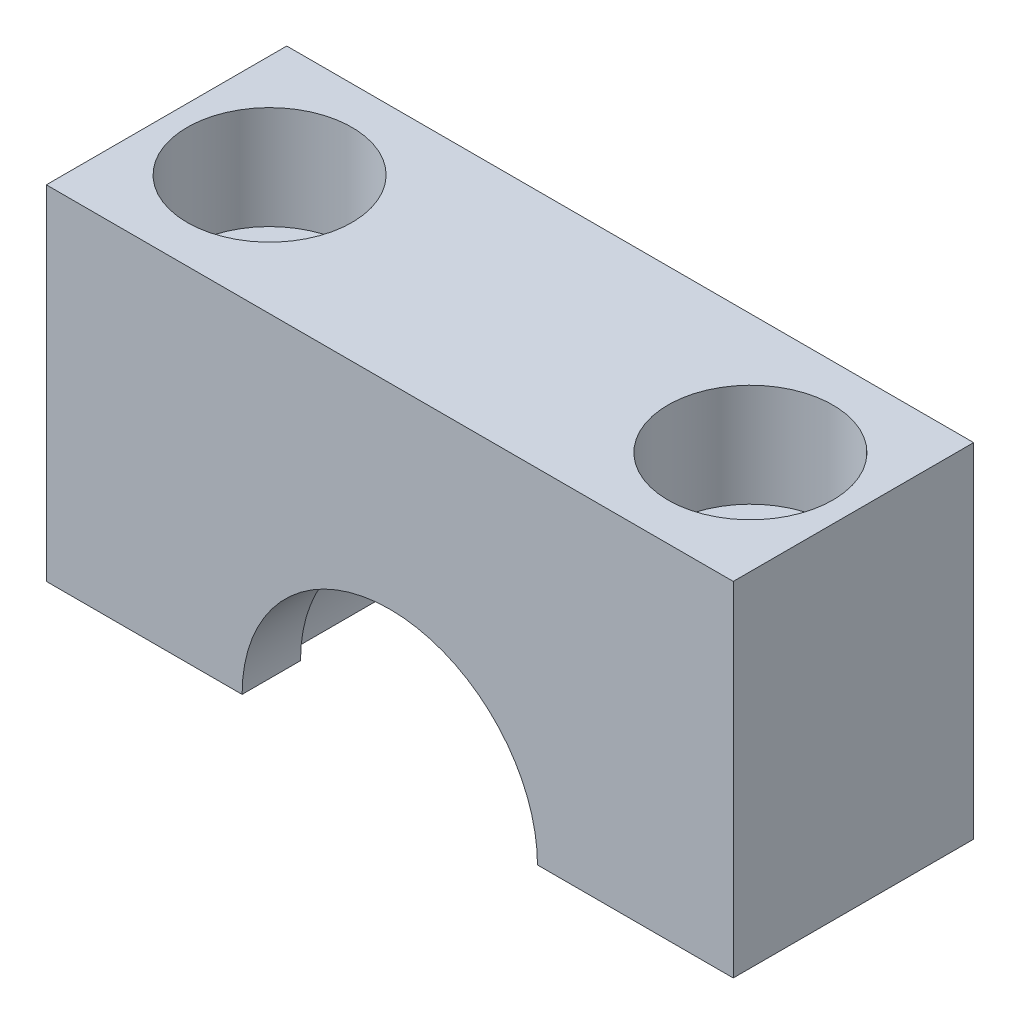
ISO-10303-21;
HEADER;
FILE_DESCRIPTION(('STEP AP214'),'2;1');
FILE_NAME('part.step','',(''),(''),'','','');
FILE_SCHEMA(('AUTOMOTIVE_DESIGN { 1 0 10303 214 1 1 1 1 }'));
ENDSEC;
DATA;
#1=APPLICATION_CONTEXT('core data for automotive mechanical design processes');
#2=APPLICATION_PROTOCOL_DEFINITION('international standard','automotive_design',2000,#1);
#3=PRODUCT_CONTEXT('',#1,'mechanical');
#4=PRODUCT('Part','Part','',(#3));
#5=PRODUCT_RELATED_PRODUCT_CATEGORY('part','',(#4));
#6=PRODUCT_DEFINITION_FORMATION('','',#4);
#7=PRODUCT_DEFINITION_CONTEXT('part definition',#1,'design');
#8=PRODUCT_DEFINITION('design','',#6,#7);
#9=PRODUCT_DEFINITION_SHAPE('','',#8);
#10=(LENGTH_UNIT() NAMED_UNIT(*) SI_UNIT(.MILLI.,.METRE.));
#11=(NAMED_UNIT(*) PLANE_ANGLE_UNIT() SI_UNIT($,.RADIAN.));
#12=(NAMED_UNIT(*) SI_UNIT($,.STERADIAN.) SOLID_ANGLE_UNIT());
#13=UNCERTAINTY_MEASURE_WITH_UNIT(LENGTH_MEASURE(1.E-05),#10,'distance_accuracy_value','');
#14=(GEOMETRIC_REPRESENTATION_CONTEXT(3) GLOBAL_UNCERTAINTY_ASSIGNED_CONTEXT((#13)) GLOBAL_UNIT_ASSIGNED_CONTEXT((#10,
#11,#12)) REPRESENTATION_CONTEXT('',''));
#15=CARTESIAN_POINT('',(0.,0.,0.));
#16=DIRECTION('',(0.,0.,1.));
#17=DIRECTION('',(1.,0.,0.));
#18=AXIS2_PLACEMENT_3D('',#15,#16,#17);
#19=CARTESIAN_POINT('',(-50.,-25.,17.5));
#20=DIRECTION('',(0.,1.,0.));
#21=DIRECTION('',(0.,0.,1.));
#22=AXIS2_PLACEMENT_3D('',#19,#20,#21);
#23=PLANE('',#22);
#24=CARTESIAN_POINT('',(-35.,-25.,0.));
#25=DIRECTION('',(0.,1.,0.));
#26=DIRECTION('',(0.,0.,1.));
#27=AXIS2_PLACEMENT_3D('',#24,#25,#26);
#28=CIRCLE('',#27,7.5);
#29=CARTESIAN_POINT('',(-35.,-25.,7.5));
#30=VERTEX_POINT('',#29);
#31=EDGE_CURVE('E140',#30,#30,#28,.T.);
#32=ORIENTED_EDGE('',*,*,#31,.T.);
#33=EDGE_LOOP('',(#32));
#34=FACE_BOUND('',#33,.T.);
#35=DIRECTION('',(1.,0.,0.));
#36=VECTOR('',#35,1.);
#37=CARTESIAN_POINT('',(-50.,-25.,-9.));
#38=LINE('',#37,#36);
#39=CARTESIAN_POINT('',(-23.5,-25.,-8.99999999999999));
#40=VERTEX_POINT('',#39);
#41=CARTESIAN_POINT('',(-21.5,-25.,-8.99999999999999));
#42=VERTEX_POINT('',#41);
#43=EDGE_CURVE('E200',#40,#42,#38,.T.);
#44=ORIENTED_EDGE('',*,*,#43,.F.);
#45=DIRECTION('',(0.,0.,1.));
#46=VECTOR('',#45,1.);
#47=CARTESIAN_POINT('',(-23.5,-25.,-8.99999999999999));
#48=LINE('',#47,#46);
#49=CARTESIAN_POINT('',(-23.5,-25.,9.));
#50=VERTEX_POINT('',#49);
#51=EDGE_CURVE('E188',#40,#50,#48,.T.);
#52=ORIENTED_EDGE('',*,*,#51,.T.);
#53=DIRECTION('',(1.,0.,0.));
#54=VECTOR('',#53,1.);
#55=CARTESIAN_POINT('',(-50.,-25.,9.00000000000001));
#56=LINE('',#55,#54);
#57=CARTESIAN_POINT('',(-21.5,-25.,9.));
#58=VERTEX_POINT('',#57);
#59=EDGE_CURVE('E122',#50,#58,#56,.T.);
#60=ORIENTED_EDGE('',*,*,#59,.T.);
#61=DIRECTION('',(0.,0.,-1.));
#62=VECTOR('',#61,1.);
#63=CARTESIAN_POINT('',(-21.5,-25.,17.5));
#64=LINE('',#63,#62);
#65=CARTESIAN_POINT('',(-21.5,-25.,17.5));
#66=VERTEX_POINT('',#65);
#67=EDGE_CURVE('E118',#66,#58,#64,.T.);
#68=ORIENTED_EDGE('',*,*,#67,.F.);
#69=DIRECTION('',(1.,0.,0.));
#70=VECTOR('',#69,1.);
#71=CARTESIAN_POINT('',(-50.,-25.,17.5));
#72=LINE('',#71,#70);
#73=CARTESIAN_POINT('',(-50.,-25.,17.5));
#74=VERTEX_POINT('',#73);
#75=EDGE_CURVE('E104',#74,#66,#72,.T.);
#76=ORIENTED_EDGE('',*,*,#75,.F.);
#77=DIRECTION('',(0.,0.,-1.));
#78=VECTOR('',#77,1.);
#79=CARTESIAN_POINT('',(-50.,-25.,17.5));
#80=LINE('',#79,#78);
#81=CARTESIAN_POINT('',(-50.,-25.,-17.5));
#82=VERTEX_POINT('',#81);
#83=EDGE_CURVE('E125',#74,#82,#80,.T.);
#84=ORIENTED_EDGE('',*,*,#83,.T.);
#85=DIRECTION('',(1.,0.,0.));
#86=VECTOR('',#85,1.);
#87=CARTESIAN_POINT('',(-50.,-25.,-17.5));
#88=LINE('',#87,#86);
#89=CARTESIAN_POINT('',(-21.5,-25.,-17.5));
#90=VERTEX_POINT('',#89);
#91=EDGE_CURVE('E144',#82,#90,#88,.T.);
#92=ORIENTED_EDGE('',*,*,#91,.T.);
#93=EDGE_CURVE('E126',#42,#90,#64,.T.);
#94=ORIENTED_EDGE('',*,*,#93,.F.);
#95=EDGE_LOOP('',(#44,#52,#60,#68,#76,#84,#92,#94));
#96=FACE_BOUND('',#95,.T.);
#97=ADVANCED_FACE('F36',(#34,#96),#23,.F.);
#98=CARTESIAN_POINT('',(0.,-25.,17.5));
#99=DIRECTION('',(0.,0.,-1.));
#100=DIRECTION('',(-1.,0.,0.));
#101=AXIS2_PLACEMENT_3D('',#98,#99,#100);
#102=CYLINDRICAL_SURFACE('',#101,21.5);
#103=CARTESIAN_POINT('',(0.,-25.,-9.));
#104=DIRECTION('',(0.,0.,1.));
#105=DIRECTION('',(1.,0.,0.));
#106=AXIS2_PLACEMENT_3D('',#103,#104,#105);
#107=CIRCLE('',#106,21.5);
#108=CARTESIAN_POINT('',(21.5,-25.,-9.));
#109=VERTEX_POINT('',#108);
#110=EDGE_CURVE('E197',#42,#109,#107,.F.);
#111=ORIENTED_EDGE('',*,*,#110,.F.);
#112=ORIENTED_EDGE('',*,*,#93,.T.);
#113=CARTESIAN_POINT('',(0.,-25.,-17.5));
#114=DIRECTION('',(0.,0.,-1.));
#115=DIRECTION('',(1.,0.,0.));
#116=AXIS2_PLACEMENT_3D('',#113,#114,#115);
#117=CIRCLE('',#116,21.5);
#118=CARTESIAN_POINT('',(21.5,-25.,-17.5));
#119=VERTEX_POINT('',#118);
#120=EDGE_CURVE('E147',#90,#119,#117,.T.);
#121=ORIENTED_EDGE('',*,*,#120,.T.);
#122=DIRECTION('',(0.,0.,-1.));
#123=VECTOR('',#122,1.);
#124=CARTESIAN_POINT('',(21.5,-25.,17.5));
#125=LINE('',#124,#123);
#126=EDGE_CURVE('E153',#109,#119,#125,.T.);
#127=ORIENTED_EDGE('',*,*,#126,.F.);
#128=EDGE_LOOP('',(#111,#112,#121,#127));
#129=FACE_BOUND('',#128,.T.);
#130=ADVANCED_FACE('F231',(#129),#102,.F.);
#131=CARTESIAN_POINT('',(21.5,-25.,17.5));
#132=DIRECTION('',(0.,1.,0.));
#133=DIRECTION('',(0.,0.,1.));
#134=AXIS2_PLACEMENT_3D('',#131,#132,#133);
#135=PLANE('',#134);
#136=CARTESIAN_POINT('',(34.9999999999999,-25.,0.));
#137=DIRECTION('',(0.,1.,0.));
#138=DIRECTION('',(0.,0.,1.));
#139=AXIS2_PLACEMENT_3D('',#136,#137,#138);
#140=CIRCLE('',#139,7.49999999999999);
#141=CARTESIAN_POINT('',(34.9999999999999,-25.,7.49999999999999));
#142=VERTEX_POINT('',#141);
#143=EDGE_CURVE('E165',#142,#142,#140,.T.);
#144=ORIENTED_EDGE('',*,*,#143,.T.);
#145=EDGE_LOOP('',(#144));
#146=FACE_BOUND('',#145,.T.);
#147=DIRECTION('',(1.,0.,0.));
#148=VECTOR('',#147,1.);
#149=CARTESIAN_POINT('',(21.5,-25.,-9.));
#150=LINE('',#149,#148);
#151=CARTESIAN_POINT('',(23.5,-25.,-9.));
#152=VERTEX_POINT('',#151);
#153=EDGE_CURVE('E11',#109,#152,#150,.T.);
#154=ORIENTED_EDGE('',*,*,#153,.F.);
#155=ORIENTED_EDGE('',*,*,#126,.T.);
#156=DIRECTION('',(1.,0.,0.));
#157=VECTOR('',#156,1.);
#158=CARTESIAN_POINT('',(21.5,-25.,-17.5));
#159=LINE('',#158,#157);
#160=CARTESIAN_POINT('',(50.,-25.,-17.5));
#161=VERTEX_POINT('',#160);
#162=EDGE_CURVE('E86',#119,#161,#159,.T.);
#163=ORIENTED_EDGE('',*,*,#162,.T.);
#164=DIRECTION('',(0.,0.,-1.));
#165=VECTOR('',#164,1.);
#166=CARTESIAN_POINT('',(50.,-25.,17.5));
#167=LINE('',#166,#165);
#168=CARTESIAN_POINT('',(50.,-25.,17.5));
#169=VERTEX_POINT('',#168);
#170=EDGE_CURVE('E132',#169,#161,#167,.T.);
#171=ORIENTED_EDGE('',*,*,#170,.F.);
#172=DIRECTION('',(1.,0.,0.));
#173=VECTOR('',#172,1.);
#174=CARTESIAN_POINT('',(21.5,-25.,17.5));
#175=LINE('',#174,#173);
#176=CARTESIAN_POINT('',(21.5,-25.,17.5));
#177=VERTEX_POINT('',#176);
#178=EDGE_CURVE('E60',#177,#169,#175,.T.);
#179=ORIENTED_EDGE('',*,*,#178,.F.);
#180=CARTESIAN_POINT('',(21.5,-25.,9.));
#181=VERTEX_POINT('',#180);
#182=EDGE_CURVE('E130',#177,#181,#125,.T.);
#183=ORIENTED_EDGE('',*,*,#182,.T.);
#184=DIRECTION('',(1.,0.,0.));
#185=VECTOR('',#184,1.);
#186=CARTESIAN_POINT('',(21.5,-25.,9.));
#187=LINE('',#186,#185);
#188=CARTESIAN_POINT('',(23.5,-25.,9.));
#189=VERTEX_POINT('',#188);
#190=EDGE_CURVE('E161',#181,#189,#187,.T.);
#191=ORIENTED_EDGE('',*,*,#190,.T.);
#192=DIRECTION('',(0.,0.,1.));
#193=VECTOR('',#192,1.);
#194=CARTESIAN_POINT('',(23.5,-25.,-9.));
#195=LINE('',#194,#193);
#196=EDGE_CURVE('E44',#189,#152,#195,.F.);
#197=ORIENTED_EDGE('',*,*,#196,.T.);
#198=EDGE_LOOP('',(#154,#155,#163,#171,#179,#183,#191,#197));
#199=FACE_BOUND('',#198,.T.);
#200=ADVANCED_FACE('F176',(#146,#199),#135,.F.);
#201=CARTESIAN_POINT('',(34.9999999999999,-25.,0.));
#202=DIRECTION('',(0.,1.,0.));
#203=DIRECTION('',(0.,0.,1.));
#204=AXIS2_PLACEMENT_3D('',#201,#202,#203);
#205=CYLINDRICAL_SURFACE('',#204,7.49999999999999);
#206=ORIENTED_EDGE('',*,*,#143,.F.);
#207=EDGE_LOOP('',(#206));
#208=FACE_BOUND('',#207,.T.);
#209=CARTESIAN_POINT('',(34.9999999999999,10.,0.));
#210=DIRECTION('',(0.,1.,0.));
#211=DIRECTION('',(0.,0.,1.));
#212=AXIS2_PLACEMENT_3D('',#209,#210,#211);
#213=CIRCLE('',#212,7.49999999999999);
#214=CARTESIAN_POINT('',(34.9999999999999,10.,7.49999999999999));
#215=VERTEX_POINT('',#214);
#216=EDGE_CURVE('E167',#215,#215,#213,.F.);
#217=ORIENTED_EDGE('',*,*,#216,.F.);
#218=EDGE_LOOP('',(#217));
#219=FACE_BOUND('',#218,.T.);
#220=ADVANCED_FACE('F247',(#208,#219),#205,.F.);
#221=CARTESIAN_POINT('',(-35.,-25.,0.));
#222=DIRECTION('',(0.,1.,0.));
#223=DIRECTION('',(0.,0.,1.));
#224=AXIS2_PLACEMENT_3D('',#221,#222,#223);
#225=CYLINDRICAL_SURFACE('',#224,7.5);
#226=ORIENTED_EDGE('',*,*,#31,.F.);
#227=EDGE_LOOP('',(#226));
#228=FACE_BOUND('',#227,.T.);
#229=CARTESIAN_POINT('',(-35.0000000000001,10.,0.));
#230=DIRECTION('',(0.,1.,0.));
#231=DIRECTION('',(0.,0.,1.));
#232=AXIS2_PLACEMENT_3D('',#229,#230,#231);
#233=CIRCLE('',#232,7.5);
#234=CARTESIAN_POINT('',(-35.0000000000001,10.,7.5));
#235=VERTEX_POINT('',#234);
#236=EDGE_CURVE('E162',#235,#235,#233,.F.);
#237=ORIENTED_EDGE('',*,*,#236,.F.);
#238=EDGE_LOOP('',(#237));
#239=FACE_BOUND('',#238,.T.);
#240=ADVANCED_FACE('F241',(#228,#239),#225,.F.);
#241=CARTESIAN_POINT('',(50.,25.,17.5));
#242=DIRECTION('',(-1.,0.,0.));
#243=DIRECTION('',(0.,0.,1.));
#244=AXIS2_PLACEMENT_3D('',#241,#242,#243);
#245=PLANE('',#244);
#246=DIRECTION('',(0.,1.,0.));
#247=VECTOR('',#246,1.);
#248=CARTESIAN_POINT('',(50.,25.,-17.5));
#249=LINE('',#248,#247);
#250=CARTESIAN_POINT('',(50.,25.,-17.5));
#251=VERTEX_POINT('',#250);
#252=EDGE_CURVE('E136',#161,#251,#249,.T.);
#253=ORIENTED_EDGE('',*,*,#252,.T.);
#254=DIRECTION('',(0.,0.,-1.));
#255=VECTOR('',#254,1.);
#256=CARTESIAN_POINT('',(50.,25.,17.5));
#257=LINE('',#256,#255);
#258=CARTESIAN_POINT('',(50.,25.,17.5));
#259=VERTEX_POINT('',#258);
#260=EDGE_CURVE('E159',#259,#251,#257,.T.);
#261=ORIENTED_EDGE('',*,*,#260,.F.);
#262=DIRECTION('',(0.,1.,0.));
#263=VECTOR('',#262,1.);
#264=CARTESIAN_POINT('',(50.,25.,17.5));
#265=LINE('',#264,#263);
#266=EDGE_CURVE('E151',#169,#259,#265,.T.);
#267=ORIENTED_EDGE('',*,*,#266,.F.);
#268=ORIENTED_EDGE('',*,*,#170,.T.);
#269=EDGE_LOOP('',(#253,#261,#267,#268));
#270=FACE_BOUND('',#269,.T.);
#271=ADVANCED_FACE('F38',(#270),#245,.F.);
#272=CARTESIAN_POINT('',(-50.,25.,17.5));
#273=DIRECTION('',(0.,-1.,0.));
#274=DIRECTION('',(0.,0.,-1.));
#275=AXIS2_PLACEMENT_3D('',#272,#273,#274);
#276=PLANE('',#275);
#277=CARTESIAN_POINT('',(35.,25.,0.));
#278=DIRECTION('',(0.,1.,0.));
#279=DIRECTION('',(0.,0.,1.));
#280=AXIS2_PLACEMENT_3D('',#277,#278,#279);
#281=CIRCLE('',#280,12.);
#282=CARTESIAN_POINT('',(35.,25.,12.));
#283=VERTEX_POINT('',#282);
#284=EDGE_CURVE('E203',#283,#283,#281,.T.);
#285=ORIENTED_EDGE('',*,*,#284,.F.);
#286=EDGE_LOOP('',(#285));
#287=FACE_BOUND('',#286,.T.);
#288=CARTESIAN_POINT('',(-35.,25.,0.));
#289=DIRECTION('',(0.,1.,0.));
#290=DIRECTION('',(0.,0.,1.));
#291=AXIS2_PLACEMENT_3D('',#288,#289,#290);
#292=CIRCLE('',#291,12.);
#293=CARTESIAN_POINT('',(-35.,25.,12.));
#294=VERTEX_POINT('',#293);
#295=EDGE_CURVE('E170',#294,#294,#292,.T.);
#296=ORIENTED_EDGE('',*,*,#295,.F.);
#297=EDGE_LOOP('',(#296));
#298=FACE_BOUND('',#297,.T.);
#299=DIRECTION('',(-1.,0.,0.));
#300=VECTOR('',#299,1.);
#301=CARTESIAN_POINT('',(-50.,25.,-17.5));
#302=LINE('',#301,#300);
#303=CARTESIAN_POINT('',(-50.,25.,-17.5));
#304=VERTEX_POINT('',#303);
#305=EDGE_CURVE('E139',#251,#304,#302,.T.);
#306=ORIENTED_EDGE('',*,*,#305,.T.);
#307=DIRECTION('',(0.,0.,-1.));
#308=VECTOR('',#307,1.);
#309=CARTESIAN_POINT('',(-50.,25.,17.5));
#310=LINE('',#309,#308);
#311=CARTESIAN_POINT('',(-50.,25.,17.5));
#312=VERTEX_POINT('',#311);
#313=EDGE_CURVE('E156',#312,#304,#310,.T.);
#314=ORIENTED_EDGE('',*,*,#313,.F.);
#315=DIRECTION('',(-1.,0.,0.));
#316=VECTOR('',#315,1.);
#317=CARTESIAN_POINT('',(-50.,25.,17.5));
#318=LINE('',#317,#316);
#319=EDGE_CURVE('E95',#259,#312,#318,.T.);
#320=ORIENTED_EDGE('',*,*,#319,.F.);
#321=ORIENTED_EDGE('',*,*,#260,.T.);
#322=EDGE_LOOP('',(#306,#314,#320,#321));
#323=FACE_BOUND('',#322,.T.);
#324=ADVANCED_FACE('F219',(#287,#298,#323),#276,.F.);
#325=CARTESIAN_POINT('',(-50.,25.,17.5));
#326=DIRECTION('',(1.,0.,0.));
#327=DIRECTION('',(0.,1.,0.));
#328=AXIS2_PLACEMENT_3D('',#325,#326,#327);
#329=PLANE('',#328);
#330=DIRECTION('',(0.,-1.,0.));
#331=VECTOR('',#330,1.);
#332=CARTESIAN_POINT('',(-50.,25.,-17.5));
#333=LINE('',#332,#331);
#334=EDGE_CURVE('E142',#304,#82,#333,.T.);
#335=ORIENTED_EDGE('',*,*,#334,.T.);
#336=ORIENTED_EDGE('',*,*,#83,.F.);
#337=DIRECTION('',(0.,-1.,0.));
#338=VECTOR('',#337,1.);
#339=CARTESIAN_POINT('',(-50.,25.,17.5));
#340=LINE('',#339,#338);
#341=EDGE_CURVE('E111',#312,#74,#340,.T.);
#342=ORIENTED_EDGE('',*,*,#341,.F.);
#343=ORIENTED_EDGE('',*,*,#313,.T.);
#344=EDGE_LOOP('',(#335,#336,#342,#343));
#345=FACE_BOUND('',#344,.T.);
#346=ADVANCED_FACE('F222',(#345),#329,.F.);
#347=ORIENTED_EDGE('',*,*,#67,.T.);
#348=CARTESIAN_POINT('',(0.,-25.,9.));
#349=DIRECTION('',(0.,0.,1.));
#350=DIRECTION('',(1.,0.,0.));
#351=AXIS2_PLACEMENT_3D('',#348,#349,#350);
#352=CIRCLE('',#351,21.5);
#353=EDGE_CURVE('E191',#58,#181,#352,.F.);
#354=ORIENTED_EDGE('',*,*,#353,.T.);
#355=ORIENTED_EDGE('',*,*,#182,.F.);
#356=CARTESIAN_POINT('',(0.,-25.,17.5));
#357=DIRECTION('',(0.,0.,-1.));
#358=DIRECTION('',(1.,0.,0.));
#359=AXIS2_PLACEMENT_3D('',#356,#357,#358);
#360=CIRCLE('',#359,21.5);
#361=EDGE_CURVE('E108',#66,#177,#360,.T.);
#362=ORIENTED_EDGE('',*,*,#361,.F.);
#363=EDGE_LOOP('',(#347,#354,#355,#362));
#364=FACE_BOUND('',#363,.T.);
#365=ADVANCED_FACE('F128',(#364),#102,.F.);
#366=CARTESIAN_POINT('',(0.,-25.,17.5));
#367=DIRECTION('',(0.,0.,1.));
#368=DIRECTION('',(1.,0.,0.));
#369=AXIS2_PLACEMENT_3D('',#366,#367,#368);
#370=PLANE('',#369);
#371=ORIENTED_EDGE('',*,*,#266,.T.);
#372=ORIENTED_EDGE('',*,*,#319,.T.);
#373=ORIENTED_EDGE('',*,*,#341,.T.);
#374=ORIENTED_EDGE('',*,*,#75,.T.);
#375=ORIENTED_EDGE('',*,*,#361,.T.);
#376=ORIENTED_EDGE('',*,*,#178,.T.);
#377=EDGE_LOOP('',(#371,#372,#373,#374,#375,#376));
#378=FACE_BOUND('',#377,.T.);
#379=ADVANCED_FACE('F106',(#378),#370,.T.);
#380=CARTESIAN_POINT('',(0.,-25.,-17.5));
#381=DIRECTION('',(0.,0.,1.));
#382=DIRECTION('',(1.,0.,0.));
#383=AXIS2_PLACEMENT_3D('',#380,#381,#382);
#384=PLANE('',#383);
#385=ORIENTED_EDGE('',*,*,#252,.F.);
#386=ORIENTED_EDGE('',*,*,#162,.F.);
#387=ORIENTED_EDGE('',*,*,#120,.F.);
#388=ORIENTED_EDGE('',*,*,#91,.F.);
#389=ORIENTED_EDGE('',*,*,#334,.F.);
#390=ORIENTED_EDGE('',*,*,#305,.F.);
#391=EDGE_LOOP('',(#385,#386,#387,#388,#389,#390));
#392=FACE_BOUND('',#391,.T.);
#393=ADVANCED_FACE('F228',(#392),#384,.F.);
#394=CARTESIAN_POINT('',(-35.0000000000001,10.,0.));
#395=DIRECTION('',(0.,1.,0.));
#396=DIRECTION('',(0.,0.,1.));
#397=AXIS2_PLACEMENT_3D('',#394,#395,#396);
#398=PLANE('',#397);
#399=CARTESIAN_POINT('',(-35.0000000000001,10.,0.));
#400=DIRECTION('',(0.,1.,0.));
#401=DIRECTION('',(0.,0.,1.));
#402=AXIS2_PLACEMENT_3D('',#399,#400,#401);
#403=CIRCLE('',#402,12.);
#404=CARTESIAN_POINT('',(-35.0000000000001,10.,12.));
#405=VERTEX_POINT('',#404);
#406=EDGE_CURVE('E166',#405,#405,#403,.T.);
#407=ORIENTED_EDGE('',*,*,#406,.T.);
#408=EDGE_LOOP('',(#407));
#409=FACE_BOUND('',#408,.T.);
#410=ORIENTED_EDGE('',*,*,#236,.T.);
#411=EDGE_LOOP('',(#410));
#412=FACE_BOUND('',#411,.T.);
#413=ADVANCED_FACE('F270',(#409,#412),#398,.T.);
#414=CARTESIAN_POINT('',(-35.0000000000001,10.,0.));
#415=DIRECTION('',(0.,1.,0.));
#416=DIRECTION('',(0.,0.,1.));
#417=AXIS2_PLACEMENT_3D('',#414,#415,#416);
#418=CYLINDRICAL_SURFACE('',#417,12.);
#419=ORIENTED_EDGE('',*,*,#406,.F.);
#420=EDGE_LOOP('',(#419));
#421=FACE_BOUND('',#420,.T.);
#422=ORIENTED_EDGE('',*,*,#295,.T.);
#423=EDGE_LOOP('',(#422));
#424=FACE_BOUND('',#423,.T.);
#425=ADVANCED_FACE('F286',(#421,#424),#418,.F.);
#426=CARTESIAN_POINT('',(34.9999999999999,10.,0.));
#427=DIRECTION('',(0.,1.,0.));
#428=DIRECTION('',(0.,0.,1.));
#429=AXIS2_PLACEMENT_3D('',#426,#427,#428);
#430=PLANE('',#429);
#431=CARTESIAN_POINT('',(34.9999999999999,10.,0.));
#432=DIRECTION('',(0.,1.,0.));
#433=DIRECTION('',(0.,0.,1.));
#434=AXIS2_PLACEMENT_3D('',#431,#432,#433);
#435=CIRCLE('',#434,12.);
#436=CARTESIAN_POINT('',(34.9999999999999,10.,12.));
#437=VERTEX_POINT('',#436);
#438=EDGE_CURVE('E171',#437,#437,#435,.T.);
#439=ORIENTED_EDGE('',*,*,#438,.T.);
#440=EDGE_LOOP('',(#439));
#441=FACE_BOUND('',#440,.T.);
#442=ORIENTED_EDGE('',*,*,#216,.T.);
#443=EDGE_LOOP('',(#442));
#444=FACE_BOUND('',#443,.T.);
#445=ADVANCED_FACE('F283',(#441,#444),#430,.T.);
#446=CARTESIAN_POINT('',(34.9999999999999,10.,0.));
#447=DIRECTION('',(0.,1.,0.));
#448=DIRECTION('',(0.,0.,1.));
#449=AXIS2_PLACEMENT_3D('',#446,#447,#448);
#450=CYLINDRICAL_SURFACE('',#449,12.);
#451=ORIENTED_EDGE('',*,*,#438,.F.);
#452=EDGE_LOOP('',(#451));
#453=FACE_BOUND('',#452,.T.);
#454=ORIENTED_EDGE('',*,*,#284,.T.);
#455=EDGE_LOOP('',(#454));
#456=FACE_BOUND('',#455,.T.);
#457=ADVANCED_FACE('F285',(#453,#456),#450,.F.);
#458=CARTESIAN_POINT('',(0.,-25.,-9.));
#459=DIRECTION('',(0.,0.,1.));
#460=DIRECTION('',(1.,0.,0.));
#461=AXIS2_PLACEMENT_3D('',#458,#459,#460);
#462=CYLINDRICAL_SURFACE('',#461,23.5);
#463=CARTESIAN_POINT('',(0.,-25.,-9.));
#464=DIRECTION('',(0.,0.,1.));
#465=DIRECTION('',(1.,0.,0.));
#466=AXIS2_PLACEMENT_3D('',#463,#464,#465);
#467=CIRCLE('',#466,23.5);
#468=EDGE_CURVE('E187',#152,#40,#467,.T.);
#469=ORIENTED_EDGE('',*,*,#468,.F.);
#470=ORIENTED_EDGE('',*,*,#196,.F.);
#471=CARTESIAN_POINT('',(0.,-25.,9.));
#472=DIRECTION('',(0.,0.,1.));
#473=DIRECTION('',(1.,0.,0.));
#474=AXIS2_PLACEMENT_3D('',#471,#472,#473);
#475=CIRCLE('',#474,23.5);
#476=EDGE_CURVE('E51',#189,#50,#475,.T.);
#477=ORIENTED_EDGE('',*,*,#476,.T.);
#478=ORIENTED_EDGE('',*,*,#51,.F.);
#479=EDGE_LOOP('',(#469,#470,#477,#478));
#480=FACE_BOUND('',#479,.T.);
#481=ADVANCED_FACE('F183',(#480),#462,.F.);
#482=CARTESIAN_POINT('',(0.,-25.,-9.));
#483=DIRECTION('',(0.,0.,1.));
#484=DIRECTION('',(1.,0.,0.));
#485=AXIS2_PLACEMENT_3D('',#482,#483,#484);
#486=PLANE('',#485);
#487=ORIENTED_EDGE('',*,*,#43,.T.);
#488=ORIENTED_EDGE('',*,*,#110,.T.);
#489=ORIENTED_EDGE('',*,*,#153,.T.);
#490=ORIENTED_EDGE('',*,*,#468,.T.);
#491=EDGE_LOOP('',(#487,#488,#489,#490));
#492=FACE_BOUND('',#491,.T.);
#493=ADVANCED_FACE('F336',(#492),#486,.T.);
#494=CARTESIAN_POINT('',(0.,-25.,9.));
#495=DIRECTION('',(0.,0.,1.));
#496=DIRECTION('',(1.,0.,0.));
#497=AXIS2_PLACEMENT_3D('',#494,#495,#496);
#498=PLANE('',#497);
#499=ORIENTED_EDGE('',*,*,#476,.F.);
#500=ORIENTED_EDGE('',*,*,#190,.F.);
#501=ORIENTED_EDGE('',*,*,#353,.F.);
#502=ORIENTED_EDGE('',*,*,#59,.F.);
#503=EDGE_LOOP('',(#499,#500,#501,#502));
#504=FACE_BOUND('',#503,.T.);
#505=ADVANCED_FACE('F238',(#504),#498,.F.);
#506=CLOSED_SHELL('',(#97,#130,#200,#220,#240,#271,#324,#346,#365,#379,#393,#413,#425,#445,#457,
#481,#493,#505));
#507=MANIFOLD_SOLID_BREP('B2',#506);
#508=ADVANCED_BREP_SHAPE_REPRESENTATION('',(#18,#507),#14);
#509=SHAPE_DEFINITION_REPRESENTATION(#9,#508);
ENDSEC;
END-ISO-10303-21;
